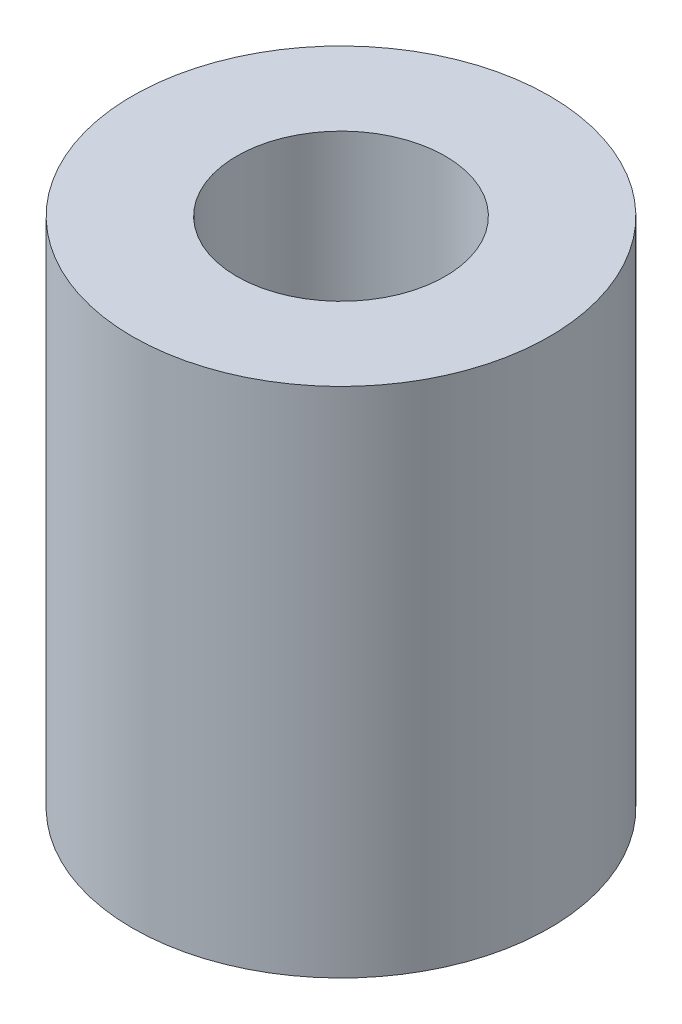
ISO-10303-21;
HEADER;
FILE_DESCRIPTION(('STEP AP214'),'2;1');
FILE_NAME('part.step','',(''),(''),'','','');
FILE_SCHEMA(('AUTOMOTIVE_DESIGN { 1 0 10303 214 1 1 1 1 }'));
ENDSEC;
DATA;
#1=APPLICATION_CONTEXT('core data for automotive mechanical design processes');
#2=APPLICATION_PROTOCOL_DEFINITION('international standard','automotive_design',2000,#1);
#3=PRODUCT_CONTEXT('',#1,'mechanical');
#4=PRODUCT('Part','Part','',(#3));
#5=PRODUCT_RELATED_PRODUCT_CATEGORY('part','',(#4));
#6=PRODUCT_DEFINITION_FORMATION('','',#4);
#7=PRODUCT_DEFINITION_CONTEXT('part definition',#1,'design');
#8=PRODUCT_DEFINITION('design','',#6,#7);
#9=PRODUCT_DEFINITION_SHAPE('','',#8);
#10=(LENGTH_UNIT() NAMED_UNIT(*) SI_UNIT(.MILLI.,.METRE.));
#11=(NAMED_UNIT(*) PLANE_ANGLE_UNIT() SI_UNIT($,.RADIAN.));
#12=(NAMED_UNIT(*) SI_UNIT($,.STERADIAN.) SOLID_ANGLE_UNIT());
#13=UNCERTAINTY_MEASURE_WITH_UNIT(LENGTH_MEASURE(1.E-05),#10,'distance_accuracy_value','');
#14=(GEOMETRIC_REPRESENTATION_CONTEXT(3) GLOBAL_UNCERTAINTY_ASSIGNED_CONTEXT((#13)) GLOBAL_UNIT_ASSIGNED_CONTEXT((#10,
#11,#12)) REPRESENTATION_CONTEXT('',''));
#15=CARTESIAN_POINT('',(0.,0.,0.));
#16=DIRECTION('',(0.,0.,1.));
#17=DIRECTION('',(1.,0.,0.));
#18=AXIS2_PLACEMENT_3D('',#15,#16,#17);
#19=CARTESIAN_POINT('',(0.,34.4,0.));
#20=DIRECTION('',(0.,1.,0.));
#21=DIRECTION('',(0.,0.,1.));
#22=AXIS2_PLACEMENT_3D('',#19,#20,#21);
#23=PLANE('',#22);
#24=CARTESIAN_POINT('',(0.,34.4,0.));
#25=DIRECTION('',(0.,1.,0.));
#26=DIRECTION('',(0.,0.,1.));
#27=AXIS2_PLACEMENT_3D('',#24,#25,#26);
#28=CIRCLE('',#27,14.);
#29=CARTESIAN_POINT('',(0.,34.4,-14.));
#30=VERTEX_POINT('',#29);
#31=EDGE_CURVE('E10',#30,#30,#28,.T.);
#32=ORIENTED_EDGE('',*,*,#31,.T.);
#33=EDGE_LOOP('',(#32));
#34=FACE_BOUND('',#33,.T.);
#35=CARTESIAN_POINT('',(0.,34.4,0.));
#36=DIRECTION('',(0.,1.,0.));
#37=DIRECTION('',(0.,0.,1.));
#38=AXIS2_PLACEMENT_3D('',#35,#36,#37);
#39=CIRCLE('',#38,7.);
#40=CARTESIAN_POINT('',(0.,34.4,-7.));
#41=VERTEX_POINT('',#40);
#42=EDGE_CURVE('E42',#41,#41,#39,.T.);
#43=ORIENTED_EDGE('',*,*,#42,.F.);
#44=EDGE_LOOP('',(#43));
#45=FACE_BOUND('',#44,.T.);
#46=ADVANCED_FACE('F31',(#34,#45),#23,.T.);
#47=CARTESIAN_POINT('',(0.,0.,0.));
#48=DIRECTION('',(0.,1.,0.));
#49=DIRECTION('',(0.,0.,1.));
#50=AXIS2_PLACEMENT_3D('',#47,#48,#49);
#51=PLANE('',#50);
#52=CARTESIAN_POINT('',(0.,0.,0.));
#53=DIRECTION('',(0.,1.,0.));
#54=DIRECTION('',(0.,0.,1.));
#55=AXIS2_PLACEMENT_3D('',#52,#53,#54);
#56=CIRCLE('',#55,14.);
#57=CARTESIAN_POINT('',(0.,0.,-14.));
#58=VERTEX_POINT('',#57);
#59=EDGE_CURVE('E35',#58,#58,#56,.T.);
#60=ORIENTED_EDGE('',*,*,#59,.F.);
#61=EDGE_LOOP('',(#60));
#62=FACE_BOUND('',#61,.T.);
#63=CARTESIAN_POINT('',(0.,0.,0.));
#64=DIRECTION('',(0.,1.,0.));
#65=DIRECTION('',(0.,0.,1.));
#66=AXIS2_PLACEMENT_3D('',#63,#64,#65);
#67=CIRCLE('',#66,7.);
#68=CARTESIAN_POINT('',(0.,0.,-7.));
#69=VERTEX_POINT('',#68);
#70=EDGE_CURVE('E44',#69,#69,#67,.T.);
#71=ORIENTED_EDGE('',*,*,#70,.T.);
#72=EDGE_LOOP('',(#71));
#73=FACE_BOUND('',#72,.T.);
#74=ADVANCED_FACE('F54',(#62,#73),#51,.F.);
#75=CARTESIAN_POINT('',(0.,34.4,0.));
#76=DIRECTION('',(0.,-1.,0.));
#77=DIRECTION('',(0.,0.,-1.));
#78=AXIS2_PLACEMENT_3D('',#75,#76,#77);
#79=CYLINDRICAL_SURFACE('',#78,14.);
#80=CARTESIAN_POINT('',(0.,34.4,-14.));
#81=CARTESIAN_POINT('',(0.,34.0416666666667,-14.));
#82=CARTESIAN_POINT('',(0.,33.6833333333333,-14.));
#83=CARTESIAN_POINT('',(0.,32.9666666666667,-14.));
#84=CARTESIAN_POINT('',(0.,32.6083333333333,-14.));
#85=CARTESIAN_POINT('',(0.,31.8916666666667,-14.));
#86=CARTESIAN_POINT('',(0.,31.5333333333333,-14.));
#87=CARTESIAN_POINT('',(0.,30.8166666666667,-14.));
#88=CARTESIAN_POINT('',(0.,30.4583333333333,-14.));
#89=CARTESIAN_POINT('',(0.,29.7416666666667,-14.));
#90=CARTESIAN_POINT('',(0.,29.3833333333333,-14.));
#91=CARTESIAN_POINT('',(0.,28.6666666666667,-14.));
#92=CARTESIAN_POINT('',(0.,28.3083333333333,-14.));
#93=CARTESIAN_POINT('',(0.,27.5916666666667,-14.));
#94=CARTESIAN_POINT('',(0.,27.2333333333333,-14.));
#95=CARTESIAN_POINT('',(0.,26.5166666666667,-14.));
#96=CARTESIAN_POINT('',(0.,26.1583333333333,-14.));
#97=CARTESIAN_POINT('',(0.,25.4416666666667,-14.));
#98=CARTESIAN_POINT('',(0.,25.0833333333333,-14.));
#99=CARTESIAN_POINT('',(0.,24.3666666666667,-14.));
#100=CARTESIAN_POINT('',(0.,24.0083333333333,-14.));
#101=CARTESIAN_POINT('',(0.,23.2916666666667,-14.));
#102=CARTESIAN_POINT('',(0.,22.9333333333333,-14.));
#103=CARTESIAN_POINT('',(0.,22.2166666666667,-14.));
#104=CARTESIAN_POINT('',(0.,21.8583333333333,-14.));
#105=CARTESIAN_POINT('',(0.,21.1416666666667,-14.));
#106=CARTESIAN_POINT('',(0.,20.7833333333333,-14.));
#107=CARTESIAN_POINT('',(0.,20.0666666666667,-14.));
#108=CARTESIAN_POINT('',(0.,19.7083333333333,-14.));
#109=CARTESIAN_POINT('',(0.,18.9916666666667,-14.));
#110=CARTESIAN_POINT('',(0.,18.6333333333333,-14.));
#111=CARTESIAN_POINT('',(0.,17.9166666666667,-14.));
#112=CARTESIAN_POINT('',(0.,17.5583333333333,-14.));
#113=CARTESIAN_POINT('',(0.,16.8416666666667,-14.));
#114=CARTESIAN_POINT('',(0.,16.4833333333333,-14.));
#115=CARTESIAN_POINT('',(0.,15.7666666666667,-14.));
#116=CARTESIAN_POINT('',(0.,15.4083333333333,-14.));
#117=CARTESIAN_POINT('',(0.,14.6916666666667,-14.));
#118=CARTESIAN_POINT('',(0.,14.3333333333333,-14.));
#119=CARTESIAN_POINT('',(0.,13.6166666666667,-14.));
#120=CARTESIAN_POINT('',(0.,13.2583333333333,-14.));
#121=CARTESIAN_POINT('',(0.,12.5416666666667,-14.));
#122=CARTESIAN_POINT('',(0.,12.1833333333333,-14.));
#123=CARTESIAN_POINT('',(0.,11.4666666666667,-14.));
#124=CARTESIAN_POINT('',(0.,11.1083333333333,-14.));
#125=CARTESIAN_POINT('',(0.,10.3916666666667,-14.));
#126=CARTESIAN_POINT('',(0.,10.0333333333333,-14.));
#127=CARTESIAN_POINT('',(0.,9.31666666666666,-14.));
#128=CARTESIAN_POINT('',(0.,8.95833333333333,-14.));
#129=CARTESIAN_POINT('',(0.,8.24166666666666,-14.));
#130=CARTESIAN_POINT('',(0.,7.88333333333333,-14.));
#131=CARTESIAN_POINT('',(0.,7.16666666666666,-14.));
#132=CARTESIAN_POINT('',(0.,6.80833333333333,-14.));
#133=CARTESIAN_POINT('',(0.,6.09166666666666,-14.));
#134=CARTESIAN_POINT('',(0.,5.73333333333333,-14.));
#135=CARTESIAN_POINT('',(0.,5.01666666666666,-14.));
#136=CARTESIAN_POINT('',(0.,4.65833333333333,-14.));
#137=CARTESIAN_POINT('',(0.,3.94166666666666,-14.));
#138=CARTESIAN_POINT('',(0.,3.58333333333333,-14.));
#139=CARTESIAN_POINT('',(0.,2.86666666666666,-14.));
#140=CARTESIAN_POINT('',(0.,2.50833333333333,-14.));
#141=CARTESIAN_POINT('',(0.,1.79166666666666,-14.));
#142=CARTESIAN_POINT('',(0.,1.43333333333333,-14.));
#143=CARTESIAN_POINT('',(0.,0.716666666666659,-14.));
#144=CARTESIAN_POINT('',(0.,0.358333333333326,-14.));
#145=CARTESIAN_POINT('',(0.,0.,-14.));
#146=B_SPLINE_CURVE_WITH_KNOTS('',3,(#80,#81,#82,#83,#84,#85,#86,#87,#88,#89,#90,#91,#92,#93,
#94,#95,#96,#97,#98,#99,#100,#101,#102,#103,#104,#105,#106,#107,#108,#109,#110,#111,#112,#113,
#114,#115,#116,#117,#118,#119,#120,#121,#122,#123,#124,#125,#126,#127,#128,#129,#130,#131,#132,
#133,#134,#135,#136,#137,#138,#139,#140,#141,#142,#143,#144,#145),.UNSPECIFIED.,.F.,.F.,(4,2,2,
2,2,2,2,2,2,2,2,2,2,2,2,2,2,2,2,2,2,2,2,2,2,2,2,2,2,2,2,2,4),(0.,1.075,2.15,3.225,4.3,5.375,
6.45,7.525,8.6,9.675,10.75,11.825,12.9,13.975,15.05,16.125,17.2,18.275,19.35,20.425,21.5,22.575,
23.65,24.725,25.8,26.875,27.95,29.025,30.1,31.175,32.25,33.325,34.4),.UNSPECIFIED.);
#147=EDGE_CURVE('BSEAM33',#30,#58,#146,.T.);
#148=ORIENTED_EDGE('',*,*,#31,.F.);
#149=ORIENTED_EDGE('',*,*,#59,.T.);
#150=ORIENTED_EDGE('',*,*,#147,.T.);
#151=ORIENTED_EDGE('',*,*,#147,.F.);
#152=EDGE_LOOP('',(#148,#150,#149,#151));
#153=FACE_BOUND('',#152,.T.);
#154=ADVANCED_FACE('F33',(#153),#79,.T.);
#155=CARTESIAN_POINT('',(0.,34.4,0.));
#156=DIRECTION('',(0.,-1.,0.));
#157=DIRECTION('',(0.,0.,-1.));
#158=AXIS2_PLACEMENT_3D('',#155,#156,#157);
#159=CYLINDRICAL_SURFACE('',#158,7.);
#160=CARTESIAN_POINT('',(0.,34.4,-7.));
#161=CARTESIAN_POINT('',(0.,34.0416666666667,-7.));
#162=CARTESIAN_POINT('',(0.,33.6833333333333,-7.));
#163=CARTESIAN_POINT('',(0.,32.9666666666667,-7.));
#164=CARTESIAN_POINT('',(0.,32.6083333333333,-7.));
#165=CARTESIAN_POINT('',(0.,31.8916666666667,-7.));
#166=CARTESIAN_POINT('',(0.,31.5333333333333,-7.));
#167=CARTESIAN_POINT('',(0.,30.8166666666667,-7.));
#168=CARTESIAN_POINT('',(0.,30.4583333333333,-7.));
#169=CARTESIAN_POINT('',(0.,29.7416666666667,-7.));
#170=CARTESIAN_POINT('',(0.,29.3833333333333,-7.));
#171=CARTESIAN_POINT('',(0.,28.6666666666667,-7.));
#172=CARTESIAN_POINT('',(0.,28.3083333333333,-7.));
#173=CARTESIAN_POINT('',(0.,27.5916666666667,-7.));
#174=CARTESIAN_POINT('',(0.,27.2333333333333,-7.));
#175=CARTESIAN_POINT('',(0.,26.5166666666667,-7.));
#176=CARTESIAN_POINT('',(0.,26.1583333333333,-7.));
#177=CARTESIAN_POINT('',(0.,25.4416666666667,-7.));
#178=CARTESIAN_POINT('',(0.,25.0833333333333,-7.));
#179=CARTESIAN_POINT('',(0.,24.3666666666667,-7.));
#180=CARTESIAN_POINT('',(0.,24.0083333333333,-7.));
#181=CARTESIAN_POINT('',(0.,23.2916666666667,-7.));
#182=CARTESIAN_POINT('',(0.,22.9333333333333,-7.));
#183=CARTESIAN_POINT('',(0.,22.2166666666667,-7.));
#184=CARTESIAN_POINT('',(0.,21.8583333333333,-7.));
#185=CARTESIAN_POINT('',(0.,21.1416666666667,-7.));
#186=CARTESIAN_POINT('',(0.,20.7833333333333,-7.));
#187=CARTESIAN_POINT('',(0.,20.0666666666667,-7.));
#188=CARTESIAN_POINT('',(0.,19.7083333333333,-7.));
#189=CARTESIAN_POINT('',(0.,18.9916666666667,-7.));
#190=CARTESIAN_POINT('',(0.,18.6333333333333,-7.));
#191=CARTESIAN_POINT('',(0.,17.9166666666667,-7.));
#192=CARTESIAN_POINT('',(0.,17.5583333333333,-7.));
#193=CARTESIAN_POINT('',(0.,16.8416666666667,-7.));
#194=CARTESIAN_POINT('',(0.,16.4833333333333,-7.));
#195=CARTESIAN_POINT('',(0.,15.7666666666667,-7.));
#196=CARTESIAN_POINT('',(0.,15.4083333333333,-7.));
#197=CARTESIAN_POINT('',(0.,14.6916666666667,-7.));
#198=CARTESIAN_POINT('',(0.,14.3333333333333,-7.));
#199=CARTESIAN_POINT('',(0.,13.6166666666667,-7.));
#200=CARTESIAN_POINT('',(0.,13.2583333333333,-7.));
#201=CARTESIAN_POINT('',(0.,12.5416666666667,-7.));
#202=CARTESIAN_POINT('',(0.,12.1833333333333,-7.));
#203=CARTESIAN_POINT('',(0.,11.4666666666667,-7.));
#204=CARTESIAN_POINT('',(0.,11.1083333333333,-7.));
#205=CARTESIAN_POINT('',(0.,10.3916666666667,-7.));
#206=CARTESIAN_POINT('',(0.,10.0333333333333,-7.));
#207=CARTESIAN_POINT('',(0.,9.31666666666666,-7.));
#208=CARTESIAN_POINT('',(0.,8.95833333333333,-7.));
#209=CARTESIAN_POINT('',(0.,8.24166666666666,-7.));
#210=CARTESIAN_POINT('',(0.,7.88333333333333,-7.));
#211=CARTESIAN_POINT('',(0.,7.16666666666666,-7.));
#212=CARTESIAN_POINT('',(0.,6.80833333333333,-7.));
#213=CARTESIAN_POINT('',(0.,6.09166666666666,-7.));
#214=CARTESIAN_POINT('',(0.,5.73333333333333,-7.));
#215=CARTESIAN_POINT('',(0.,5.01666666666666,-7.));
#216=CARTESIAN_POINT('',(0.,4.65833333333333,-7.));
#217=CARTESIAN_POINT('',(0.,3.94166666666666,-7.));
#218=CARTESIAN_POINT('',(0.,3.58333333333333,-7.));
#219=CARTESIAN_POINT('',(0.,2.86666666666666,-7.));
#220=CARTESIAN_POINT('',(0.,2.50833333333333,-7.));
#221=CARTESIAN_POINT('',(0.,1.79166666666666,-7.));
#222=CARTESIAN_POINT('',(0.,1.43333333333333,-7.));
#223=CARTESIAN_POINT('',(0.,0.716666666666659,-7.));
#224=CARTESIAN_POINT('',(0.,0.358333333333326,-7.));
#225=CARTESIAN_POINT('',(0.,0.,-7.));
#226=B_SPLINE_CURVE_WITH_KNOTS('',3,(#160,#161,#162,#163,#164,#165,#166,#167,#168,#169,#170,
#171,#172,#173,#174,#175,#176,#177,#178,#179,#180,#181,#182,#183,#184,#185,#186,#187,#188,#189,
#190,#191,#192,#193,#194,#195,#196,#197,#198,#199,#200,#201,#202,#203,#204,#205,#206,#207,#208,
#209,#210,#211,#212,#213,#214,#215,#216,#217,#218,#219,#220,#221,#222,#223,#224,#225),
.UNSPECIFIED.,.F.,.F.,(4,2,2,2,2,2,2,2,2,2,2,2,2,2,2,2,2,2,2,2,2,2,2,2,2,2,2,2,2,2,2,2,4),(0.,
1.075,2.15,3.225,4.3,5.375,6.45,7.525,8.6,9.675,10.75,11.825,12.9,13.975,15.05,16.125,17.2,
18.275,19.35,20.425,21.5,22.575,23.65,24.725,25.8,26.875,27.95,29.025,30.1,31.175,32.25,33.325,
34.4),.UNSPECIFIED.);
#227=EDGE_CURVE('BSEAM50',#41,#69,#226,.T.);
#228=ORIENTED_EDGE('',*,*,#42,.T.);
#229=ORIENTED_EDGE('',*,*,#70,.F.);
#230=ORIENTED_EDGE('',*,*,#227,.T.);
#231=ORIENTED_EDGE('',*,*,#227,.F.);
#232=EDGE_LOOP('',(#228,#230,#229,#231));
#233=FACE_BOUND('',#232,.T.);
#234=ADVANCED_FACE('F50',(#233),#159,.F.);
#235=CLOSED_SHELL('',(#46,#74,#154,#234));
#236=MANIFOLD_SOLID_BREP('B2',#235);
#237=ADVANCED_BREP_SHAPE_REPRESENTATION('',(#18,#236),#14);
#238=SHAPE_DEFINITION_REPRESENTATION(#9,#237);
ENDSEC;
END-ISO-10303-21;
